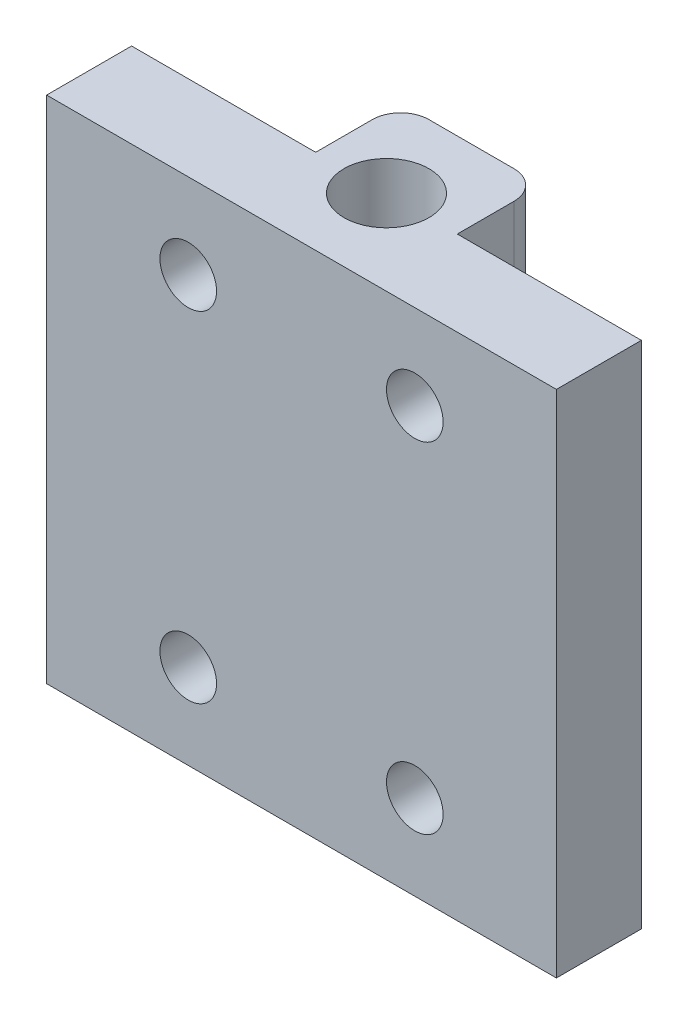
ISO-10303-21;
HEADER;
FILE_DESCRIPTION(('STEP AP214'),'2;1');
FILE_NAME('part.step','',(''),(''),'','','');
FILE_SCHEMA(('AUTOMOTIVE_DESIGN { 1 0 10303 214 1 1 1 1 }'));
ENDSEC;
DATA;
#1=APPLICATION_CONTEXT('core data for automotive mechanical design processes');
#2=APPLICATION_PROTOCOL_DEFINITION('international standard','automotive_design',2000,#1);
#3=PRODUCT_CONTEXT('',#1,'mechanical');
#4=PRODUCT('Part','Part','',(#3));
#5=PRODUCT_RELATED_PRODUCT_CATEGORY('part','',(#4));
#6=PRODUCT_DEFINITION_FORMATION('','',#4);
#7=PRODUCT_DEFINITION_CONTEXT('part definition',#1,'design');
#8=PRODUCT_DEFINITION('design','',#6,#7);
#9=PRODUCT_DEFINITION_SHAPE('','',#8);
#10=(LENGTH_UNIT() NAMED_UNIT(*) SI_UNIT(.MILLI.,.METRE.));
#11=(NAMED_UNIT(*) PLANE_ANGLE_UNIT() SI_UNIT($,.RADIAN.));
#12=(NAMED_UNIT(*) SI_UNIT($,.STERADIAN.) SOLID_ANGLE_UNIT());
#13=UNCERTAINTY_MEASURE_WITH_UNIT(LENGTH_MEASURE(1.E-05),#10,'distance_accuracy_value','');
#14=(GEOMETRIC_REPRESENTATION_CONTEXT(3) GLOBAL_UNCERTAINTY_ASSIGNED_CONTEXT((#13)) GLOBAL_UNIT_ASSIGNED_CONTEXT((#10,
#11,#12)) REPRESENTATION_CONTEXT('',''));
#15=CARTESIAN_POINT('',(0.,0.,0.));
#16=DIRECTION('',(0.,0.,1.));
#17=DIRECTION('',(1.,0.,0.));
#18=AXIS2_PLACEMENT_3D('',#15,#16,#17);
#19=CARTESIAN_POINT('',(0.,0.,0.));
#20=DIRECTION('',(0.,0.,1.));
#21=DIRECTION('',(1.,0.,0.));
#22=AXIS2_PLACEMENT_3D('',#19,#20,#21);
#23=PLANE('',#22);
#24=CARTESIAN_POINT('',(-3.99999999999999,-6.00000000000001,0.));
#25=DIRECTION('',(0.,0.,1.));
#26=DIRECTION('',(1.,0.,0.));
#27=AXIS2_PLACEMENT_3D('',#24,#25,#26);
#28=CIRCLE('',#27,1.);
#29=CARTESIAN_POINT('',(-2.99999999999999,-6.00000000000001,0.));
#30=VERTEX_POINT('',#29);
#31=EDGE_CURVE('E166',#30,#30,#28,.T.);
#32=ORIENTED_EDGE('',*,*,#31,.T.);
#33=EDGE_LOOP('',(#32));
#34=FACE_BOUND('',#33,.T.);
#35=CARTESIAN_POINT('',(-3.99999999999998,5.99999999999999,0.));
#36=DIRECTION('',(0.,0.,1.));
#37=DIRECTION('',(1.,0.,0.));
#38=AXIS2_PLACEMENT_3D('',#35,#36,#37);
#39=CIRCLE('',#38,1.);
#40=CARTESIAN_POINT('',(-2.99999999999998,5.99999999999999,0.));
#41=VERTEX_POINT('',#40);
#42=EDGE_CURVE('E163',#41,#41,#39,.T.);
#43=ORIENTED_EDGE('',*,*,#42,.T.);
#44=EDGE_LOOP('',(#43));
#45=FACE_BOUND('',#44,.T.);
#46=DIRECTION('',(0.,1.,0.));
#47=VECTOR('',#46,1.);
#48=CARTESIAN_POINT('',(-2.5,-14.8309518948453,0.));
#49=LINE('',#48,#47);
#50=CARTESIAN_POINT('',(-2.5,-9.,0.));
#51=VERTEX_POINT('',#50);
#52=CARTESIAN_POINT('',(-2.5,9.,0.));
#53=VERTEX_POINT('',#52);
#54=EDGE_CURVE('E131',#51,#53,#49,.T.);
#55=ORIENTED_EDGE('',*,*,#54,.F.);
#56=DIRECTION('',(1.,0.,0.));
#57=VECTOR('',#56,1.);
#58=CARTESIAN_POINT('',(9.,-9.,0.));
#59=LINE('',#58,#57);
#60=CARTESIAN_POINT('',(-9.,-9.,0.));
#61=VERTEX_POINT('',#60);
#62=EDGE_CURVE('E183',#61,#51,#59,.T.);
#63=ORIENTED_EDGE('',*,*,#62,.F.);
#64=DIRECTION('',(0.,-1.,0.));
#65=VECTOR('',#64,1.);
#66=CARTESIAN_POINT('',(-9.,-9.,0.));
#67=LINE('',#66,#65);
#68=CARTESIAN_POINT('',(-9.,9.,0.));
#69=VERTEX_POINT('',#68);
#70=EDGE_CURVE('E134',#69,#61,#67,.T.);
#71=ORIENTED_EDGE('',*,*,#70,.F.);
#72=DIRECTION('',(-1.,0.,0.));
#73=VECTOR('',#72,1.);
#74=CARTESIAN_POINT('',(9.,9.,0.));
#75=LINE('',#74,#73);
#76=EDGE_CURVE('E122',#53,#69,#75,.T.);
#77=ORIENTED_EDGE('',*,*,#76,.F.);
#78=EDGE_LOOP('',(#55,#63,#71,#77));
#79=FACE_BOUND('',#78,.T.);
#80=ADVANCED_FACE('F39',(#34,#45,#79),#23,.F.);
#81=CARTESIAN_POINT('',(-9.,-9.,3.));
#82=DIRECTION('',(1.,0.,0.));
#83=DIRECTION('',(0.,0.,-1.));
#84=AXIS2_PLACEMENT_3D('',#81,#82,#83);
#85=PLANE('',#84);
#86=ORIENTED_EDGE('',*,*,#70,.T.);
#87=DIRECTION('',(0.,0.,-1.));
#88=VECTOR('',#87,1.);
#89=CARTESIAN_POINT('',(-9.,-9.,3.));
#90=LINE('',#89,#88);
#91=CARTESIAN_POINT('',(-9.,-9.,3.));
#92=VERTEX_POINT('',#91);
#93=EDGE_CURVE('E194',#92,#61,#90,.T.);
#94=ORIENTED_EDGE('',*,*,#93,.F.);
#95=DIRECTION('',(0.,-1.,0.));
#96=VECTOR('',#95,1.);
#97=CARTESIAN_POINT('',(-9.,-9.,3.));
#98=LINE('',#97,#96);
#99=CARTESIAN_POINT('',(-9.,9.,3.));
#100=VERTEX_POINT('',#99);
#101=EDGE_CURVE('E171',#100,#92,#98,.T.);
#102=ORIENTED_EDGE('',*,*,#101,.F.);
#103=DIRECTION('',(0.,0.,-1.));
#104=VECTOR('',#103,1.);
#105=CARTESIAN_POINT('',(-9.,9.,3.));
#106=LINE('',#105,#104);
#107=EDGE_CURVE('E180',#100,#69,#106,.T.);
#108=ORIENTED_EDGE('',*,*,#107,.T.);
#109=EDGE_LOOP('',(#86,#94,#102,#108));
#110=FACE_BOUND('',#109,.T.);
#111=ADVANCED_FACE('F230',(#110),#85,.F.);
#112=CARTESIAN_POINT('',(9.,-9.,3.));
#113=DIRECTION('',(0.,1.,0.));
#114=DIRECTION('',(-1.,0.,0.));
#115=AXIS2_PLACEMENT_3D('',#112,#113,#114);
#116=PLANE('',#115);
#117=CARTESIAN_POINT('',(0.,-9.00000000000001,0.));
#118=DIRECTION('',(0.,1.,0.));
#119=DIRECTION('',(-1.,0.,0.));
#120=AXIS2_PLACEMENT_3D('',#117,#118,#119);
#121=CIRCLE('',#120,1.5);
#122=CARTESIAN_POINT('',(-1.5,-9.00000000000001,0.));
#123=VERTEX_POINT('',#122);
#124=EDGE_CURVE('E127',#123,#123,#121,.T.);
#125=ORIENTED_EDGE('',*,*,#124,.T.);
#126=EDGE_LOOP('',(#125));
#127=FACE_BOUND('',#126,.T.);
#128=DIRECTION('',(0.,0.,-1.));
#129=VECTOR('',#128,1.);
#130=CARTESIAN_POINT('',(-2.5,-9.,0.));
#131=LINE('',#130,#129);
#132=CARTESIAN_POINT('',(-2.5,-9.,-2.));
#133=VERTEX_POINT('',#132);
#134=EDGE_CURVE('E139',#51,#133,#131,.T.);
#135=ORIENTED_EDGE('',*,*,#134,.T.);
#136=CARTESIAN_POINT('',(-1.5,-9.,-2.));
#137=DIRECTION('',(0.,1.,0.));
#138=DIRECTION('',(-1.,0.,0.));
#139=AXIS2_PLACEMENT_3D('',#136,#137,#138);
#140=CIRCLE('',#139,1.);
#141=CARTESIAN_POINT('',(-1.5,-9.,-3.));
#142=VERTEX_POINT('',#141);
#143=EDGE_CURVE('E47',#133,#142,#140,.F.);
#144=ORIENTED_EDGE('',*,*,#143,.T.);
#145=DIRECTION('',(1.,0.,0.));
#146=VECTOR('',#145,1.);
#147=CARTESIAN_POINT('',(-2.5,-9.,-3.));
#148=LINE('',#147,#146);
#149=CARTESIAN_POINT('',(1.5,-9.,-3.));
#150=VERTEX_POINT('',#149);
#151=EDGE_CURVE('E209',#142,#150,#148,.T.);
#152=ORIENTED_EDGE('',*,*,#151,.T.);
#153=CARTESIAN_POINT('',(1.5,-9.,-2.));
#154=DIRECTION('',(0.,1.,0.));
#155=DIRECTION('',(-1.,0.,0.));
#156=AXIS2_PLACEMENT_3D('',#153,#154,#155);
#157=CIRCLE('',#156,1.);
#158=CARTESIAN_POINT('',(2.5,-9.,-2.));
#159=VERTEX_POINT('',#158);
#160=EDGE_CURVE('E54',#150,#159,#157,.F.);
#161=ORIENTED_EDGE('',*,*,#160,.T.);
#162=DIRECTION('',(0.,0.,1.));
#163=VECTOR('',#162,1.);
#164=CARTESIAN_POINT('',(2.5,-9.,-3.));
#165=LINE('',#164,#163);
#166=CARTESIAN_POINT('',(2.5,-9.,0.));
#167=VERTEX_POINT('',#166);
#168=EDGE_CURVE('E143',#159,#167,#165,.T.);
#169=ORIENTED_EDGE('',*,*,#168,.T.);
#170=CARTESIAN_POINT('',(9.,-9.,0.));
#171=VERTEX_POINT('',#170);
#172=EDGE_CURVE('E182',#167,#171,#59,.T.);
#173=ORIENTED_EDGE('',*,*,#172,.T.);
#174=DIRECTION('',(0.,0.,-1.));
#175=VECTOR('',#174,1.);
#176=CARTESIAN_POINT('',(9.,-9.,3.));
#177=LINE('',#176,#175);
#178=CARTESIAN_POINT('',(9.,-9.,3.));
#179=VERTEX_POINT('',#178);
#180=EDGE_CURVE('E191',#179,#171,#177,.T.);
#181=ORIENTED_EDGE('',*,*,#180,.F.);
#182=DIRECTION('',(1.,0.,0.));
#183=VECTOR('',#182,1.);
#184=CARTESIAN_POINT('',(9.,-9.,3.));
#185=LINE('',#184,#183);
#186=EDGE_CURVE('E174',#92,#179,#185,.T.);
#187=ORIENTED_EDGE('',*,*,#186,.F.);
#188=ORIENTED_EDGE('',*,*,#93,.T.);
#189=ORIENTED_EDGE('',*,*,#62,.T.);
#190=EDGE_LOOP('',(#135,#144,#152,#161,#169,#173,#181,#187,#188,#189));
#191=FACE_BOUND('',#190,.T.);
#192=ADVANCED_FACE('F208',(#127,#191),#116,.F.);
#193=CARTESIAN_POINT('',(9.,-9.,3.));
#194=DIRECTION('',(-1.,0.,0.));
#195=DIRECTION('',(0.,0.,1.));
#196=AXIS2_PLACEMENT_3D('',#193,#194,#195);
#197=PLANE('',#196);
#198=DIRECTION('',(0.,1.,0.));
#199=VECTOR('',#198,1.);
#200=CARTESIAN_POINT('',(9.,-9.,0.));
#201=LINE('',#200,#199);
#202=CARTESIAN_POINT('',(9.,9.,0.));
#203=VERTEX_POINT('',#202);
#204=EDGE_CURVE('E136',#171,#203,#201,.T.);
#205=ORIENTED_EDGE('',*,*,#204,.T.);
#206=DIRECTION('',(0.,0.,-1.));
#207=VECTOR('',#206,1.);
#208=CARTESIAN_POINT('',(9.,9.,3.));
#209=LINE('',#208,#207);
#210=CARTESIAN_POINT('',(9.,9.,3.));
#211=VERTEX_POINT('',#210);
#212=EDGE_CURVE('E188',#211,#203,#209,.T.);
#213=ORIENTED_EDGE('',*,*,#212,.F.);
#214=DIRECTION('',(0.,1.,0.));
#215=VECTOR('',#214,1.);
#216=CARTESIAN_POINT('',(9.,-9.,3.));
#217=LINE('',#216,#215);
#218=EDGE_CURVE('E176',#179,#211,#217,.T.);
#219=ORIENTED_EDGE('',*,*,#218,.F.);
#220=ORIENTED_EDGE('',*,*,#180,.T.);
#221=EDGE_LOOP('',(#205,#213,#219,#220));
#222=FACE_BOUND('',#221,.T.);
#223=ADVANCED_FACE('F280',(#222),#197,.F.);
#224=CARTESIAN_POINT('',(9.,9.,3.));
#225=DIRECTION('',(0.,-1.,0.));
#226=DIRECTION('',(1.,0.,0.));
#227=AXIS2_PLACEMENT_3D('',#224,#225,#226);
#228=PLANE('',#227);
#229=CARTESIAN_POINT('',(0.,9.,0.));
#230=DIRECTION('',(0.,1.,0.));
#231=DIRECTION('',(-1.,0.,0.));
#232=AXIS2_PLACEMENT_3D('',#229,#230,#231);
#233=CIRCLE('',#232,1.5);
#234=CARTESIAN_POINT('',(-1.5,9.,0.));
#235=VERTEX_POINT('',#234);
#236=EDGE_CURVE('E270',#235,#235,#233,.T.);
#237=ORIENTED_EDGE('',*,*,#236,.F.);
#238=EDGE_LOOP('',(#237));
#239=FACE_BOUND('',#238,.T.);
#240=DIRECTION('',(-1.,0.,0.));
#241=VECTOR('',#240,1.);
#242=CARTESIAN_POINT('',(-2.5,9.,-3.));
#243=LINE('',#242,#241);
#244=CARTESIAN_POINT('',(1.5,9.,-3.));
#245=VERTEX_POINT('',#244);
#246=CARTESIAN_POINT('',(-1.5,9.,-3.));
#247=VERTEX_POINT('',#246);
#248=EDGE_CURVE('E141',#245,#247,#243,.T.);
#249=ORIENTED_EDGE('',*,*,#248,.T.);
#250=CARTESIAN_POINT('',(-1.5,9.,-2.));
#251=DIRECTION('',(0.,-1.,0.));
#252=DIRECTION('',(1.,0.,0.));
#253=AXIS2_PLACEMENT_3D('',#250,#251,#252);
#254=CIRCLE('',#253,1.);
#255=CARTESIAN_POINT('',(-2.5,9.,-2.));
#256=VERTEX_POINT('',#255);
#257=EDGE_CURVE('E124',#247,#256,#254,.F.);
#258=ORIENTED_EDGE('',*,*,#257,.T.);
#259=DIRECTION('',(0.,0.,1.));
#260=VECTOR('',#259,1.);
#261=CARTESIAN_POINT('',(-2.5,9.,0.));
#262=LINE('',#261,#260);
#263=EDGE_CURVE('E117',#256,#53,#262,.T.);
#264=ORIENTED_EDGE('',*,*,#263,.T.);
#265=ORIENTED_EDGE('',*,*,#76,.T.);
#266=ORIENTED_EDGE('',*,*,#107,.F.);
#267=DIRECTION('',(-1.,0.,0.));
#268=VECTOR('',#267,1.);
#269=CARTESIAN_POINT('',(9.,9.,3.));
#270=LINE('',#269,#268);
#271=EDGE_CURVE('E178',#211,#100,#270,.T.);
#272=ORIENTED_EDGE('',*,*,#271,.F.);
#273=ORIENTED_EDGE('',*,*,#212,.T.);
#274=CARTESIAN_POINT('',(2.5,9.,0.));
#275=VERTEX_POINT('',#274);
#276=EDGE_CURVE('E135',#203,#275,#75,.T.);
#277=ORIENTED_EDGE('',*,*,#276,.T.);
#278=DIRECTION('',(0.,0.,-1.));
#279=VECTOR('',#278,1.);
#280=CARTESIAN_POINT('',(2.5,9.,-3.));
#281=LINE('',#280,#279);
#282=CARTESIAN_POINT('',(2.5,9.,-2.));
#283=VERTEX_POINT('',#282);
#284=EDGE_CURVE('E126',#275,#283,#281,.T.);
#285=ORIENTED_EDGE('',*,*,#284,.T.);
#286=CARTESIAN_POINT('',(1.5,9.,-2.));
#287=DIRECTION('',(0.,-1.,0.));
#288=DIRECTION('',(1.,0.,0.));
#289=AXIS2_PLACEMENT_3D('',#286,#287,#288);
#290=CIRCLE('',#289,1.);
#291=EDGE_CURVE('E202',#283,#245,#290,.F.);
#292=ORIENTED_EDGE('',*,*,#291,.T.);
#293=EDGE_LOOP('',(#249,#258,#264,#265,#266,#272,#273,#277,#285,#292));
#294=FACE_BOUND('',#293,.T.);
#295=ADVANCED_FACE('F120',(#239,#294),#228,.F.);
#296=CARTESIAN_POINT('',(0.,0.,3.));
#297=DIRECTION('',(0.,0.,1.));
#298=DIRECTION('',(1.,0.,0.));
#299=AXIS2_PLACEMENT_3D('',#296,#297,#298);
#300=PLANE('',#299);
#301=CARTESIAN_POINT('',(-3.99999999999998,5.99999999999999,3.));
#302=DIRECTION('',(0.,0.,1.));
#303=DIRECTION('',(1.,0.,0.));
#304=AXIS2_PLACEMENT_3D('',#301,#302,#303);
#305=CIRCLE('',#304,1.);
#306=CARTESIAN_POINT('',(-2.99999999999998,5.99999999999999,3.));
#307=VERTEX_POINT('',#306);
#308=EDGE_CURVE('E160',#307,#307,#305,.T.);
#309=ORIENTED_EDGE('',*,*,#308,.F.);
#310=EDGE_LOOP('',(#309));
#311=FACE_BOUND('',#310,.T.);
#312=CARTESIAN_POINT('',(4.00000000000002,5.99999999999999,3.));
#313=DIRECTION('',(0.,0.,1.));
#314=DIRECTION('',(1.,0.,0.));
#315=AXIS2_PLACEMENT_3D('',#312,#313,#314);
#316=CIRCLE('',#315,1.);
#317=CARTESIAN_POINT('',(5.00000000000002,5.99999999999999,3.));
#318=VERTEX_POINT('',#317);
#319=EDGE_CURVE('E154',#318,#318,#316,.T.);
#320=ORIENTED_EDGE('',*,*,#319,.F.);
#321=EDGE_LOOP('',(#320));
#322=FACE_BOUND('',#321,.T.);
#323=CARTESIAN_POINT('',(4.00000000000001,-6.00000000000001,3.));
#324=DIRECTION('',(0.,0.,1.));
#325=DIRECTION('',(1.,0.,0.));
#326=AXIS2_PLACEMENT_3D('',#323,#324,#325);
#327=CIRCLE('',#326,1.);
#328=CARTESIAN_POINT('',(5.00000000000001,-6.00000000000001,3.));
#329=VERTEX_POINT('',#328);
#330=EDGE_CURVE('E147',#329,#329,#327,.T.);
#331=ORIENTED_EDGE('',*,*,#330,.F.);
#332=EDGE_LOOP('',(#331));
#333=FACE_BOUND('',#332,.T.);
#334=CARTESIAN_POINT('',(-3.99999999999999,-6.00000000000001,3.));
#335=DIRECTION('',(0.,0.,1.));
#336=DIRECTION('',(1.,0.,0.));
#337=AXIS2_PLACEMENT_3D('',#334,#335,#336);
#338=CIRCLE('',#337,1.);
#339=CARTESIAN_POINT('',(-2.99999999999999,-6.00000000000001,3.));
#340=VERTEX_POINT('',#339);
#341=EDGE_CURVE('E150',#340,#340,#338,.T.);
#342=ORIENTED_EDGE('',*,*,#341,.F.);
#343=EDGE_LOOP('',(#342));
#344=FACE_BOUND('',#343,.T.);
#345=ORIENTED_EDGE('',*,*,#101,.T.);
#346=ORIENTED_EDGE('',*,*,#186,.T.);
#347=ORIENTED_EDGE('',*,*,#218,.T.);
#348=ORIENTED_EDGE('',*,*,#271,.T.);
#349=EDGE_LOOP('',(#345,#346,#347,#348));
#350=FACE_BOUND('',#349,.T.);
#351=ADVANCED_FACE('F243',(#311,#322,#333,#344,#350),#300,.T.);
#352=CARTESIAN_POINT('',(4.00000000000002,5.99999999999999,0.));
#353=DIRECTION('',(0.,0.,1.));
#354=DIRECTION('',(1.,0.,0.));
#355=AXIS2_PLACEMENT_3D('',#352,#353,#354);
#356=CIRCLE('',#355,1.);
#357=CARTESIAN_POINT('',(5.00000000000002,5.99999999999999,0.));
#358=VERTEX_POINT('',#357);
#359=EDGE_CURVE('E157',#358,#358,#356,.T.);
#360=ORIENTED_EDGE('',*,*,#359,.T.);
#361=EDGE_LOOP('',(#360));
#362=FACE_BOUND('',#361,.T.);
#363=CARTESIAN_POINT('',(4.00000000000001,-6.00000000000001,0.));
#364=DIRECTION('',(0.,0.,1.));
#365=DIRECTION('',(1.,0.,0.));
#366=AXIS2_PLACEMENT_3D('',#363,#364,#365);
#367=CIRCLE('',#366,1.);
#368=CARTESIAN_POINT('',(5.00000000000001,-6.00000000000001,0.));
#369=VERTEX_POINT('',#368);
#370=EDGE_CURVE('E151',#369,#369,#367,.T.);
#371=ORIENTED_EDGE('',*,*,#370,.T.);
#372=EDGE_LOOP('',(#371));
#373=FACE_BOUND('',#372,.T.);
#374=ORIENTED_EDGE('',*,*,#172,.F.);
#375=DIRECTION('',(0.,1.,0.));
#376=VECTOR('',#375,1.);
#377=CARTESIAN_POINT('',(2.5,-14.8309518948453,0.));
#378=LINE('',#377,#376);
#379=EDGE_CURVE('E140',#167,#275,#378,.T.);
#380=ORIENTED_EDGE('',*,*,#379,.T.);
#381=ORIENTED_EDGE('',*,*,#276,.F.);
#382=ORIENTED_EDGE('',*,*,#204,.F.);
#383=EDGE_LOOP('',(#374,#380,#381,#382));
#384=FACE_BOUND('',#383,.T.);
#385=ADVANCED_FACE('F233',(#362,#373,#384),#23,.F.);
#386=CARTESIAN_POINT('',(-3.99999999999999,-6.00000000000001,0.));
#387=DIRECTION('',(0.,0.,1.));
#388=DIRECTION('',(1.,0.,0.));
#389=AXIS2_PLACEMENT_3D('',#386,#387,#388);
#390=CYLINDRICAL_SURFACE('',#389,1.);
#391=ORIENTED_EDGE('',*,*,#31,.F.);
#392=EDGE_LOOP('',(#391));
#393=FACE_BOUND('',#392,.T.);
#394=ORIENTED_EDGE('',*,*,#341,.T.);
#395=EDGE_LOOP('',(#394));
#396=FACE_BOUND('',#395,.T.);
#397=ADVANCED_FACE('F242',(#393,#396),#390,.F.);
#398=CARTESIAN_POINT('',(4.00000000000001,-6.00000000000001,0.));
#399=DIRECTION('',(0.,0.,1.));
#400=DIRECTION('',(1.,0.,0.));
#401=AXIS2_PLACEMENT_3D('',#398,#399,#400);
#402=CYLINDRICAL_SURFACE('',#401,1.);
#403=ORIENTED_EDGE('',*,*,#370,.F.);
#404=EDGE_LOOP('',(#403));
#405=FACE_BOUND('',#404,.T.);
#406=ORIENTED_EDGE('',*,*,#330,.T.);
#407=EDGE_LOOP('',(#406));
#408=FACE_BOUND('',#407,.T.);
#409=ADVANCED_FACE('F249',(#405,#408),#402,.F.);
#410=CARTESIAN_POINT('',(4.00000000000002,5.99999999999999,0.));
#411=DIRECTION('',(0.,0.,1.));
#412=DIRECTION('',(1.,0.,0.));
#413=AXIS2_PLACEMENT_3D('',#410,#411,#412);
#414=CYLINDRICAL_SURFACE('',#413,1.);
#415=ORIENTED_EDGE('',*,*,#359,.F.);
#416=EDGE_LOOP('',(#415));
#417=FACE_BOUND('',#416,.T.);
#418=ORIENTED_EDGE('',*,*,#319,.T.);
#419=EDGE_LOOP('',(#418));
#420=FACE_BOUND('',#419,.T.);
#421=ADVANCED_FACE('F326',(#417,#420),#414,.F.);
#422=CARTESIAN_POINT('',(-3.99999999999998,5.99999999999999,0.));
#423=DIRECTION('',(0.,0.,1.));
#424=DIRECTION('',(1.,0.,0.));
#425=AXIS2_PLACEMENT_3D('',#422,#423,#424);
#426=CYLINDRICAL_SURFACE('',#425,1.);
#427=ORIENTED_EDGE('',*,*,#42,.F.);
#428=EDGE_LOOP('',(#427));
#429=FACE_BOUND('',#428,.T.);
#430=ORIENTED_EDGE('',*,*,#308,.T.);
#431=EDGE_LOOP('',(#430));
#432=FACE_BOUND('',#431,.T.);
#433=ADVANCED_FACE('F337',(#429,#432),#426,.F.);
#434=CARTESIAN_POINT('',(-2.5,-14.8309518948453,0.));
#435=DIRECTION('',(-1.,0.,0.));
#436=DIRECTION('',(0.,-1.,0.));
#437=AXIS2_PLACEMENT_3D('',#434,#435,#436);
#438=PLANE('',#437);
#439=ORIENTED_EDGE('',*,*,#263,.F.);
#440=DIRECTION('',(0.,1.,0.));
#441=VECTOR('',#440,1.);
#442=CARTESIAN_POINT('',(-2.5,-14.8309518948453,-2.));
#443=LINE('',#442,#441);
#444=EDGE_CURVE('E62',#256,#133,#443,.F.);
#445=ORIENTED_EDGE('',*,*,#444,.T.);
#446=ORIENTED_EDGE('',*,*,#134,.F.);
#447=ORIENTED_EDGE('',*,*,#54,.T.);
#448=EDGE_LOOP('',(#439,#445,#446,#447));
#449=FACE_BOUND('',#448,.T.);
#450=ADVANCED_FACE('F138',(#449),#438,.T.);
#451=CARTESIAN_POINT('',(-2.5,-14.8309518948453,-3.));
#452=DIRECTION('',(0.,0.,-1.));
#453=DIRECTION('',(-1.,0.,0.));
#454=AXIS2_PLACEMENT_3D('',#451,#452,#453);
#455=PLANE('',#454);
#456=ORIENTED_EDGE('',*,*,#151,.F.);
#457=DIRECTION('',(0.,1.,0.));
#458=VECTOR('',#457,1.);
#459=CARTESIAN_POINT('',(-1.5,-14.8309518948453,-3.));
#460=LINE('',#459,#458);
#461=EDGE_CURVE('E199',#142,#247,#460,.T.);
#462=ORIENTED_EDGE('',*,*,#461,.T.);
#463=ORIENTED_EDGE('',*,*,#248,.F.);
#464=DIRECTION('',(0.,1.,0.));
#465=VECTOR('',#464,1.);
#466=CARTESIAN_POINT('',(1.5,-14.8309518948453,-3.));
#467=LINE('',#466,#465);
#468=EDGE_CURVE('E197',#245,#150,#467,.F.);
#469=ORIENTED_EDGE('',*,*,#468,.T.);
#470=EDGE_LOOP('',(#456,#462,#463,#469));
#471=FACE_BOUND('',#470,.T.);
#472=ADVANCED_FACE('F213',(#471),#455,.T.);
#473=CARTESIAN_POINT('',(2.5,-14.8309518948453,-3.));
#474=DIRECTION('',(1.,0.,0.));
#475=DIRECTION('',(0.,0.,-1.));
#476=AXIS2_PLACEMENT_3D('',#473,#474,#475);
#477=PLANE('',#476);
#478=ORIENTED_EDGE('',*,*,#168,.F.);
#479=DIRECTION('',(0.,1.,0.));
#480=VECTOR('',#479,1.);
#481=CARTESIAN_POINT('',(2.5,-14.8309518948453,-2.));
#482=LINE('',#481,#480);
#483=EDGE_CURVE('E11',#159,#283,#482,.T.);
#484=ORIENTED_EDGE('',*,*,#483,.T.);
#485=ORIENTED_EDGE('',*,*,#284,.F.);
#486=ORIENTED_EDGE('',*,*,#379,.F.);
#487=EDGE_LOOP('',(#478,#484,#485,#486));
#488=FACE_BOUND('',#487,.T.);
#489=ADVANCED_FACE('F225',(#488),#477,.T.);
#490=CARTESIAN_POINT('',(0.,-9.00000000000001,0.));
#491=DIRECTION('',(0.,1.,0.));
#492=DIRECTION('',(-1.,0.,0.));
#493=AXIS2_PLACEMENT_3D('',#490,#491,#492);
#494=CYLINDRICAL_SURFACE('',#493,1.5);
#495=ORIENTED_EDGE('',*,*,#124,.F.);
#496=EDGE_LOOP('',(#495));
#497=FACE_BOUND('',#496,.T.);
#498=ORIENTED_EDGE('',*,*,#236,.T.);
#499=EDGE_LOOP('',(#498));
#500=FACE_BOUND('',#499,.T.);
#501=ADVANCED_FACE('F219',(#497,#500),#494,.F.);
#502=CARTESIAN_POINT('',(-1.5,-14.8309518948453,-2.));
#503=DIRECTION('',(0.,1.,0.));
#504=DIRECTION('',(-1.,0.,0.));
#505=AXIS2_PLACEMENT_3D('',#502,#503,#504);
#506=CYLINDRICAL_SURFACE('',#505,1.);
#507=ORIENTED_EDGE('',*,*,#143,.F.);
#508=ORIENTED_EDGE('',*,*,#444,.F.);
#509=ORIENTED_EDGE('',*,*,#257,.F.);
#510=ORIENTED_EDGE('',*,*,#461,.F.);
#511=EDGE_LOOP('',(#507,#508,#509,#510));
#512=FACE_BOUND('',#511,.T.);
#513=ADVANCED_FACE('F217',(#512),#506,.T.);
#514=CARTESIAN_POINT('',(1.5,-14.8309518948453,-2.));
#515=DIRECTION('',(0.,1.,0.));
#516=DIRECTION('',(-1.,0.,0.));
#517=AXIS2_PLACEMENT_3D('',#514,#515,#516);
#518=CYLINDRICAL_SURFACE('',#517,1.);
#519=ORIENTED_EDGE('',*,*,#160,.F.);
#520=ORIENTED_EDGE('',*,*,#468,.F.);
#521=ORIENTED_EDGE('',*,*,#291,.F.);
#522=ORIENTED_EDGE('',*,*,#483,.F.);
#523=EDGE_LOOP('',(#519,#520,#521,#522));
#524=FACE_BOUND('',#523,.T.);
#525=ADVANCED_FACE('F41',(#524),#518,.T.);
#526=CLOSED_SHELL('',(#80,#111,#192,#223,#295,#351,#385,#397,#409,#421,#433,#450,#472,#489,#501,
#513,#525));
#527=MANIFOLD_SOLID_BREP('B2',#526);
#528=ADVANCED_BREP_SHAPE_REPRESENTATION('',(#18,#527),#14);
#529=SHAPE_DEFINITION_REPRESENTATION(#9,#528);
ENDSEC;
END-ISO-10303-21;
